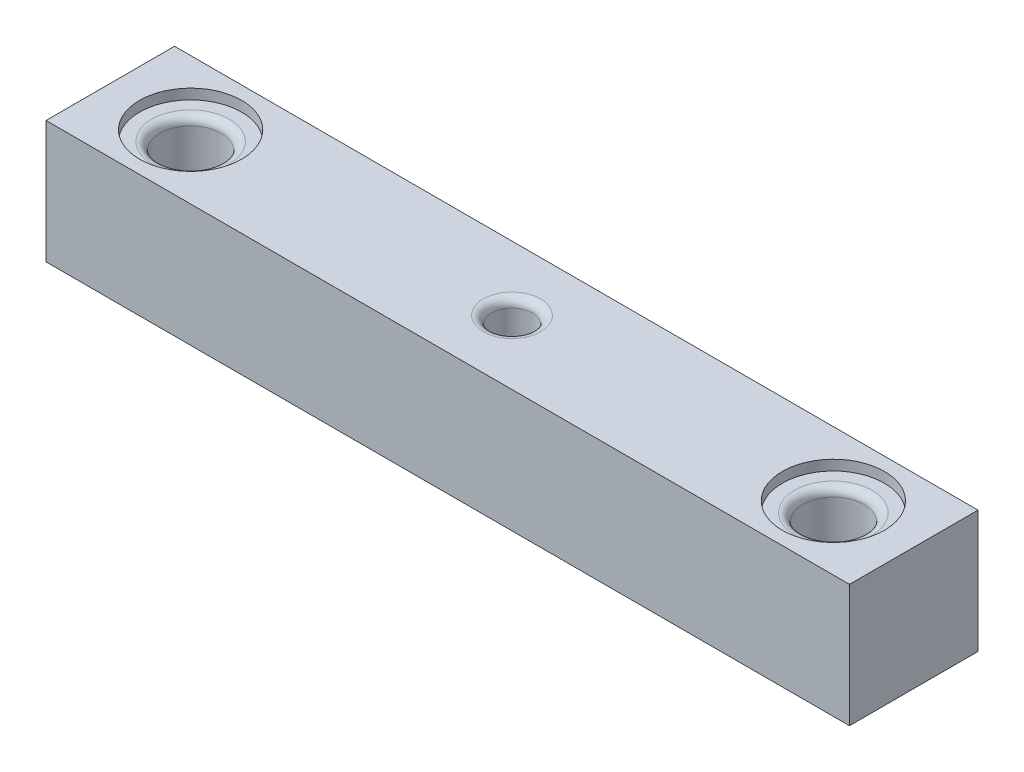
ISO-10303-21;
HEADER;
FILE_DESCRIPTION(('STEP AP214'),'2;1');
FILE_NAME('part.step','',(''),(''),'','','');
FILE_SCHEMA(('AUTOMOTIVE_DESIGN { 1 0 10303 214 1 1 1 1 }'));
ENDSEC;
DATA;
#1=APPLICATION_CONTEXT('core data for automotive mechanical design processes');
#2=APPLICATION_PROTOCOL_DEFINITION('international standard','automotive_design',2000,#1);
#3=PRODUCT_CONTEXT('',#1,'mechanical');
#4=PRODUCT('Part','Part','',(#3));
#5=PRODUCT_RELATED_PRODUCT_CATEGORY('part','',(#4));
#6=PRODUCT_DEFINITION_FORMATION('','',#4);
#7=PRODUCT_DEFINITION_CONTEXT('part definition',#1,'design');
#8=PRODUCT_DEFINITION('design','',#6,#7);
#9=PRODUCT_DEFINITION_SHAPE('','',#8);
#10=(LENGTH_UNIT() NAMED_UNIT(*) SI_UNIT(.MILLI.,.METRE.));
#11=(NAMED_UNIT(*) PLANE_ANGLE_UNIT() SI_UNIT($,.RADIAN.));
#12=(NAMED_UNIT(*) SI_UNIT($,.STERADIAN.) SOLID_ANGLE_UNIT());
#13=UNCERTAINTY_MEASURE_WITH_UNIT(LENGTH_MEASURE(1.E-05),#10,'distance_accuracy_value','');
#14=(GEOMETRIC_REPRESENTATION_CONTEXT(3) GLOBAL_UNCERTAINTY_ASSIGNED_CONTEXT((#13)) GLOBAL_UNIT_ASSIGNED_CONTEXT((#10,
#11,#12)) REPRESENTATION_CONTEXT('',''));
#15=CARTESIAN_POINT('',(0.,0.,0.));
#16=DIRECTION('',(0.,0.,1.));
#17=DIRECTION('',(1.,0.,0.));
#18=AXIS2_PLACEMENT_3D('',#15,#16,#17);
#19=CARTESIAN_POINT('',(-100.,38.1,-1.66533453693773E-13));
#20=DIRECTION('',(0.,-1.,0.));
#21=DIRECTION('',(0.,0.,-1.));
#22=AXIS2_PLACEMENT_3D('',#19,#20,#21);
#23=CYLINDRICAL_SURFACE('',#22,9.52500000000001);
#24=CARTESIAN_POINT('',(-100.,32.385,-1.66533453693773E-13));
#25=DIRECTION('',(0.,1.,0.));
#26=DIRECTION('',(0.,0.,1.));
#27=AXIS2_PLACEMENT_3D('',#24,#25,#26);
#28=CIRCLE('',#27,9.52500000000001);
#29=CARTESIAN_POINT('',(-100.,32.385,-9.52500000000017));
#30=VERTEX_POINT('',#29);
#31=EDGE_CURVE('E159',#30,#30,#28,.T.);
#32=CARTESIAN_POINT('',(-100.,0.,-1.66533453693773E-13));
#33=DIRECTION('',(0.,1.,0.));
#34=DIRECTION('',(0.,0.,1.));
#35=AXIS2_PLACEMENT_3D('',#32,#33,#34);
#36=CIRCLE('',#35,9.52500000000001);
#37=CARTESIAN_POINT('',(-100.,0.,-9.52500000000017));
#38=VERTEX_POINT('',#37);
#39=EDGE_CURVE('E126',#38,#38,#36,.T.);
#40=CARTESIAN_POINT('',(-100.,32.385,-9.52500000000017));
#41=CARTESIAN_POINT('',(-100.,32.04765625,-9.52500000000017));
#42=CARTESIAN_POINT('',(-100.,31.7103125,-9.52500000000017));
#43=CARTESIAN_POINT('',(-100.,31.035625,-9.52500000000017));
#44=CARTESIAN_POINT('',(-100.,30.69828125,-9.52500000000017));
#45=CARTESIAN_POINT('',(-100.,30.02359375,-9.52500000000017));
#46=CARTESIAN_POINT('',(-100.,29.68625,-9.52500000000017));
#47=CARTESIAN_POINT('',(-100.,29.0115625,-9.52500000000017));
#48=CARTESIAN_POINT('',(-100.,28.67421875,-9.52500000000017));
#49=CARTESIAN_POINT('',(-100.,27.99953125,-9.52500000000017));
#50=CARTESIAN_POINT('',(-100.,27.6621875,-9.52500000000017));
#51=CARTESIAN_POINT('',(-100.,26.9875,-9.52500000000017));
#52=CARTESIAN_POINT('',(-100.,26.65015625,-9.52500000000017));
#53=CARTESIAN_POINT('',(-100.,25.97546875,-9.52500000000017));
#54=CARTESIAN_POINT('',(-100.,25.638125,-9.52500000000017));
#55=CARTESIAN_POINT('',(-100.,24.9634375,-9.52500000000017));
#56=CARTESIAN_POINT('',(-100.,24.62609375,-9.52500000000017));
#57=CARTESIAN_POINT('',(-100.,23.95140625,-9.52500000000017));
#58=CARTESIAN_POINT('',(-100.,23.6140625,-9.52500000000017));
#59=CARTESIAN_POINT('',(-100.,22.939375,-9.52500000000017));
#60=CARTESIAN_POINT('',(-100.,22.60203125,-9.52500000000017));
#61=CARTESIAN_POINT('',(-100.,21.92734375,-9.52500000000017));
#62=CARTESIAN_POINT('',(-100.,21.59,-9.52500000000017));
#63=CARTESIAN_POINT('',(-100.,20.9153125,-9.52500000000017));
#64=CARTESIAN_POINT('',(-100.,20.57796875,-9.52500000000017));
#65=CARTESIAN_POINT('',(-100.,19.90328125,-9.52500000000017));
#66=CARTESIAN_POINT('',(-100.,19.5659375,-9.52500000000017));
#67=CARTESIAN_POINT('',(-100.,18.89125,-9.52500000000017));
#68=CARTESIAN_POINT('',(-100.,18.55390625,-9.52500000000017));
#69=CARTESIAN_POINT('',(-100.,17.87921875,-9.52500000000017));
#70=CARTESIAN_POINT('',(-100.,17.541875,-9.52500000000017));
#71=CARTESIAN_POINT('',(-100.,16.8671875,-9.52500000000017));
#72=CARTESIAN_POINT('',(-100.,16.52984375,-9.52500000000017));
#73=CARTESIAN_POINT('',(-100.,15.85515625,-9.52500000000017));
#74=CARTESIAN_POINT('',(-100.,15.5178125,-9.52500000000017));
#75=CARTESIAN_POINT('',(-100.,14.843125,-9.52500000000017));
#76=CARTESIAN_POINT('',(-100.,14.50578125,-9.52500000000017));
#77=CARTESIAN_POINT('',(-100.,13.83109375,-9.52500000000017));
#78=CARTESIAN_POINT('',(-100.,13.49375,-9.52500000000017));
#79=CARTESIAN_POINT('',(-100.,12.8190625,-9.52500000000017));
#80=CARTESIAN_POINT('',(-100.,12.48171875,-9.52500000000017));
#81=CARTESIAN_POINT('',(-100.,11.80703125,-9.52500000000017));
#82=CARTESIAN_POINT('',(-100.,11.4696875,-9.52500000000017));
#83=CARTESIAN_POINT('',(-100.,10.795,-9.52500000000017));
#84=CARTESIAN_POINT('',(-100.,10.45765625,-9.52500000000017));
#85=CARTESIAN_POINT('',(-100.,9.78296874999999,-9.52500000000017));
#86=CARTESIAN_POINT('',(-100.,9.445625,-9.52500000000017));
#87=CARTESIAN_POINT('',(-100.,8.7709375,-9.52500000000017));
#88=CARTESIAN_POINT('',(-100.,8.43359375,-9.52500000000017));
#89=CARTESIAN_POINT('',(-100.,7.75890625,-9.52500000000017));
#90=CARTESIAN_POINT('',(-100.,7.4215625,-9.52500000000017));
#91=CARTESIAN_POINT('',(-100.,6.746875,-9.52500000000017));
#92=CARTESIAN_POINT('',(-100.,6.40953125,-9.52500000000017));
#93=CARTESIAN_POINT('',(-100.,5.73484375,-9.52500000000017));
#94=CARTESIAN_POINT('',(-100.,5.3975,-9.52500000000017));
#95=CARTESIAN_POINT('',(-100.,4.7228125,-9.52500000000017));
#96=CARTESIAN_POINT('',(-100.,4.38546875,-9.52500000000017));
#97=CARTESIAN_POINT('',(-100.,3.71078125,-9.52500000000017));
#98=CARTESIAN_POINT('',(-100.,3.3734375,-9.52500000000017));
#99=CARTESIAN_POINT('',(-100.,2.69875,-9.52500000000017));
#100=CARTESIAN_POINT('',(-100.,2.36140624999999,-9.52500000000017));
#101=CARTESIAN_POINT('',(-100.,1.68671875,-9.52500000000017));
#102=CARTESIAN_POINT('',(-100.,1.349375,-9.52500000000017));
#103=CARTESIAN_POINT('',(-100.,0.674687500000002,-9.52500000000017));
#104=CARTESIAN_POINT('',(-100.,0.337343750000001,-9.52500000000017));
#105=CARTESIAN_POINT('',(-100.,0.,-9.52500000000017));
#106=B_SPLINE_CURVE_WITH_KNOTS('',3,(#40,#41,#42,#43,#44,#45,#46,#47,#48,#49,#50,#51,#52,#53,
#54,#55,#56,#57,#58,#59,#60,#61,#62,#63,#64,#65,#66,#67,#68,#69,#70,#71,#72,#73,#74,#75,#76,#77,
#78,#79,#80,#81,#82,#83,#84,#85,#86,#87,#88,#89,#90,#91,#92,#93,#94,#95,#96,#97,#98,#99,#100,
#101,#102,#103,#104,#105),.UNSPECIFIED.,.F.,.F.,(4,2,2,2,2,2,2,2,2,2,2,2,2,2,2,2,2,2,2,2,2,2,2,
2,2,2,2,2,2,2,2,2,4),(0.,1.01203125,2.0240625,3.03609375,4.048125,5.06015625,6.07218750000001,
7.08421875,8.09625000000001,9.10828125,10.1203125,11.13234375,12.144375,13.15640625,14.1684375,
15.18046875,16.1925,17.20453125,18.2165625,19.22859375,20.240625,21.25265625,22.2646875,
23.27671875,24.28875,25.30078125,26.3128125,27.32484375,28.336875,29.34890625,30.3609375,
31.37296875,32.385),.UNSPECIFIED.);
#107=EDGE_CURVE('BSEAM51',#30,#38,#106,.T.);
#108=ORIENTED_EDGE('',*,*,#31,.T.);
#109=ORIENTED_EDGE('',*,*,#39,.F.);
#110=ORIENTED_EDGE('',*,*,#107,.T.);
#111=ORIENTED_EDGE('',*,*,#107,.F.);
#112=EDGE_LOOP('',(#108,#110,#109,#111));
#113=FACE_BOUND('',#112,.T.);
#114=ADVANCED_FACE('F51',(#113),#23,.F.);
#115=CARTESIAN_POINT('',(100.,38.1,-1.66533453693773E-13));
#116=DIRECTION('',(0.,-1.,0.));
#117=DIRECTION('',(0.,0.,-1.));
#118=AXIS2_PLACEMENT_3D('',#115,#116,#117);
#119=CYLINDRICAL_SURFACE('',#118,9.52500000000001);
#120=CARTESIAN_POINT('',(100.,32.385,-1.66533453693773E-13));
#121=DIRECTION('',(0.,1.,0.));
#122=DIRECTION('',(0.,0.,1.));
#123=AXIS2_PLACEMENT_3D('',#120,#121,#122);
#124=CIRCLE('',#123,9.52500000000001);
#125=CARTESIAN_POINT('',(100.,32.385,-9.52500000000017));
#126=VERTEX_POINT('',#125);
#127=EDGE_CURVE('E148',#126,#126,#124,.T.);
#128=CARTESIAN_POINT('',(100.,0.,-1.66533453693773E-13));
#129=DIRECTION('',(0.,1.,0.));
#130=DIRECTION('',(0.,0.,1.));
#131=AXIS2_PLACEMENT_3D('',#128,#129,#130);
#132=CIRCLE('',#131,9.52500000000001);
#133=CARTESIAN_POINT('',(100.,0.,-9.52500000000017));
#134=VERTEX_POINT('',#133);
#135=EDGE_CURVE('E124',#134,#134,#132,.T.);
#136=CARTESIAN_POINT('',(100.,32.385,-9.52500000000017));
#137=CARTESIAN_POINT('',(100.,32.04765625,-9.52500000000017));
#138=CARTESIAN_POINT('',(100.,31.7103125,-9.52500000000017));
#139=CARTESIAN_POINT('',(100.,31.035625,-9.52500000000017));
#140=CARTESIAN_POINT('',(100.,30.69828125,-9.52500000000017));
#141=CARTESIAN_POINT('',(100.,30.02359375,-9.52500000000017));
#142=CARTESIAN_POINT('',(100.,29.68625,-9.52500000000017));
#143=CARTESIAN_POINT('',(100.,29.0115625,-9.52500000000017));
#144=CARTESIAN_POINT('',(100.,28.67421875,-9.52500000000017));
#145=CARTESIAN_POINT('',(100.,27.99953125,-9.52500000000017));
#146=CARTESIAN_POINT('',(100.,27.6621875,-9.52500000000017));
#147=CARTESIAN_POINT('',(100.,26.9875,-9.52500000000017));
#148=CARTESIAN_POINT('',(100.,26.65015625,-9.52500000000017));
#149=CARTESIAN_POINT('',(100.,25.97546875,-9.52500000000017));
#150=CARTESIAN_POINT('',(100.,25.638125,-9.52500000000017));
#151=CARTESIAN_POINT('',(100.,24.9634375,-9.52500000000017));
#152=CARTESIAN_POINT('',(100.,24.62609375,-9.52500000000017));
#153=CARTESIAN_POINT('',(100.,23.95140625,-9.52500000000017));
#154=CARTESIAN_POINT('',(100.,23.6140625,-9.52500000000017));
#155=CARTESIAN_POINT('',(100.,22.939375,-9.52500000000017));
#156=CARTESIAN_POINT('',(100.,22.60203125,-9.52500000000017));
#157=CARTESIAN_POINT('',(100.,21.92734375,-9.52500000000017));
#158=CARTESIAN_POINT('',(100.,21.59,-9.52500000000017));
#159=CARTESIAN_POINT('',(100.,20.9153125,-9.52500000000017));
#160=CARTESIAN_POINT('',(100.,20.57796875,-9.52500000000017));
#161=CARTESIAN_POINT('',(100.,19.90328125,-9.52500000000017));
#162=CARTESIAN_POINT('',(100.,19.5659375,-9.52500000000017));
#163=CARTESIAN_POINT('',(100.,18.89125,-9.52500000000017));
#164=CARTESIAN_POINT('',(100.,18.55390625,-9.52500000000017));
#165=CARTESIAN_POINT('',(100.,17.87921875,-9.52500000000017));
#166=CARTESIAN_POINT('',(100.,17.541875,-9.52500000000017));
#167=CARTESIAN_POINT('',(100.,16.8671875,-9.52500000000017));
#168=CARTESIAN_POINT('',(100.,16.52984375,-9.52500000000017));
#169=CARTESIAN_POINT('',(100.,15.85515625,-9.52500000000017));
#170=CARTESIAN_POINT('',(100.,15.5178125,-9.52500000000017));
#171=CARTESIAN_POINT('',(100.,14.843125,-9.52500000000017));
#172=CARTESIAN_POINT('',(100.,14.50578125,-9.52500000000017));
#173=CARTESIAN_POINT('',(100.,13.83109375,-9.52500000000017));
#174=CARTESIAN_POINT('',(100.,13.49375,-9.52500000000017));
#175=CARTESIAN_POINT('',(100.,12.8190625,-9.52500000000017));
#176=CARTESIAN_POINT('',(100.,12.48171875,-9.52500000000017));
#177=CARTESIAN_POINT('',(100.,11.80703125,-9.52500000000017));
#178=CARTESIAN_POINT('',(100.,11.4696875,-9.52500000000017));
#179=CARTESIAN_POINT('',(100.,10.795,-9.52500000000017));
#180=CARTESIAN_POINT('',(100.,10.45765625,-9.52500000000017));
#181=CARTESIAN_POINT('',(100.,9.78296874999999,-9.52500000000017));
#182=CARTESIAN_POINT('',(100.,9.445625,-9.52500000000017));
#183=CARTESIAN_POINT('',(100.,8.7709375,-9.52500000000017));
#184=CARTESIAN_POINT('',(100.,8.43359375,-9.52500000000017));
#185=CARTESIAN_POINT('',(100.,7.75890625,-9.52500000000017));
#186=CARTESIAN_POINT('',(100.,7.4215625,-9.52500000000017));
#187=CARTESIAN_POINT('',(100.,6.746875,-9.52500000000017));
#188=CARTESIAN_POINT('',(100.,6.40953125,-9.52500000000017));
#189=CARTESIAN_POINT('',(100.,5.73484375,-9.52500000000017));
#190=CARTESIAN_POINT('',(100.,5.3975,-9.52500000000017));
#191=CARTESIAN_POINT('',(100.,4.7228125,-9.52500000000017));
#192=CARTESIAN_POINT('',(100.,4.38546875,-9.52500000000017));
#193=CARTESIAN_POINT('',(100.,3.71078125,-9.52500000000017));
#194=CARTESIAN_POINT('',(100.,3.3734375,-9.52500000000017));
#195=CARTESIAN_POINT('',(100.,2.69875,-9.52500000000017));
#196=CARTESIAN_POINT('',(100.,2.36140624999999,-9.52500000000017));
#197=CARTESIAN_POINT('',(100.,1.68671875,-9.52500000000017));
#198=CARTESIAN_POINT('',(100.,1.349375,-9.52500000000017));
#199=CARTESIAN_POINT('',(100.,0.674687500000002,-9.52500000000017));
#200=CARTESIAN_POINT('',(100.,0.337343750000001,-9.52500000000017));
#201=CARTESIAN_POINT('',(100.,0.,-9.52500000000017));
#202=B_SPLINE_CURVE_WITH_KNOTS('',3,(#136,#137,#138,#139,#140,#141,#142,#143,#144,#145,#146,
#147,#148,#149,#150,#151,#152,#153,#154,#155,#156,#157,#158,#159,#160,#161,#162,#163,#164,#165,
#166,#167,#168,#169,#170,#171,#172,#173,#174,#175,#176,#177,#178,#179,#180,#181,#182,#183,#184,
#185,#186,#187,#188,#189,#190,#191,#192,#193,#194,#195,#196,#197,#198,#199,#200,#201),
.UNSPECIFIED.,.F.,.F.,(4,2,2,2,2,2,2,2,2,2,2,2,2,2,2,2,2,2,2,2,2,2,2,2,2,2,2,2,2,2,2,2,4),(0.,
1.01203125,2.0240625,3.03609375,4.048125,5.06015625,6.07218750000001,7.08421875,
8.09625000000001,9.10828125,10.1203125,11.13234375,12.144375,13.15640625,14.1684375,15.18046875,
16.1925,17.20453125,18.2165625,19.22859375,20.240625,21.25265625,22.2646875,23.27671875,
24.28875,25.30078125,26.3128125,27.32484375,28.336875,29.34890625,30.3609375,31.37296875,
32.385),.UNSPECIFIED.);
#203=EDGE_CURVE('BSEAM181',#126,#134,#202,.T.);
#204=ORIENTED_EDGE('',*,*,#127,.T.);
#205=ORIENTED_EDGE('',*,*,#135,.F.);
#206=ORIENTED_EDGE('',*,*,#203,.T.);
#207=ORIENTED_EDGE('',*,*,#203,.F.);
#208=EDGE_LOOP('',(#204,#206,#205,#207));
#209=FACE_BOUND('',#208,.T.);
#210=ADVANCED_FACE('F181',(#209),#119,.F.);
#211=CARTESIAN_POINT('',(0.,38.1,19.9999999999999));
#212=DIRECTION('',(0.,0.,-1.));
#213=DIRECTION('',(-1.,0.,0.));
#214=AXIS2_PLACEMENT_3D('',#211,#212,#213);
#215=PLANE('',#214);
#216=DIRECTION('',(1.,0.,0.));
#217=VECTOR('',#216,1.);
#218=CARTESIAN_POINT('',(0.,0.,19.9999999999999));
#219=LINE('',#218,#217);
#220=CARTESIAN_POINT('',(-124.999999999999,0.,19.9999999999999));
#221=VERTEX_POINT('',#220);
#222=CARTESIAN_POINT('',(125.000000000001,0.,19.9999999999999));
#223=VERTEX_POINT('',#222);
#224=EDGE_CURVE('E134',#221,#223,#219,.T.);
#225=ORIENTED_EDGE('',*,*,#224,.T.);
#226=DIRECTION('',(0.,-1.,0.));
#227=VECTOR('',#226,1.);
#228=CARTESIAN_POINT('',(125.000000000001,38.1,19.9999999999999));
#229=LINE('',#228,#227);
#230=CARTESIAN_POINT('',(125.000000000001,38.1,19.9999999999999));
#231=VERTEX_POINT('',#230);
#232=EDGE_CURVE('E107',#231,#223,#229,.T.);
#233=ORIENTED_EDGE('',*,*,#232,.F.);
#234=DIRECTION('',(1.,0.,0.));
#235=VECTOR('',#234,1.);
#236=CARTESIAN_POINT('',(0.,38.1,19.9999999999999));
#237=LINE('',#236,#235);
#238=CARTESIAN_POINT('',(-124.999999999999,38.1,19.9999999999999));
#239=VERTEX_POINT('',#238);
#240=EDGE_CURVE('E95',#239,#231,#237,.T.);
#241=ORIENTED_EDGE('',*,*,#240,.F.);
#242=DIRECTION('',(0.,-1.,0.));
#243=VECTOR('',#242,1.);
#244=CARTESIAN_POINT('',(-124.999999999999,38.1,19.9999999999999));
#245=LINE('',#244,#243);
#246=EDGE_CURVE('E118',#239,#221,#245,.T.);
#247=ORIENTED_EDGE('',*,*,#246,.T.);
#248=EDGE_LOOP('',(#225,#233,#241,#247));
#249=FACE_BOUND('',#248,.T.);
#250=ADVANCED_FACE('F189',(#249),#215,.F.);
#251=CARTESIAN_POINT('',(125.000000000001,38.1,0.));
#252=DIRECTION('',(1.,0.,0.));
#253=DIRECTION('',(0.,0.,-1.));
#254=AXIS2_PLACEMENT_3D('',#251,#252,#253);
#255=PLANE('',#254);
#256=DIRECTION('',(0.,0.,1.));
#257=VECTOR('',#256,1.);
#258=CARTESIAN_POINT('',(125.000000000001,0.,0.));
#259=LINE('',#258,#257);
#260=CARTESIAN_POINT('',(125.000000000001,0.,-20.0000000000001));
#261=VERTEX_POINT('',#260);
#262=EDGE_CURVE('E101',#261,#223,#259,.T.);
#263=ORIENTED_EDGE('',*,*,#262,.F.);
#264=DIRECTION('',(0.,-1.,0.));
#265=VECTOR('',#264,1.);
#266=CARTESIAN_POINT('',(125.000000000001,38.1,-20.0000000000001));
#267=LINE('',#266,#265);
#268=CARTESIAN_POINT('',(125.000000000001,38.1,-20.0000000000001));
#269=VERTEX_POINT('',#268);
#270=EDGE_CURVE('E100',#269,#261,#267,.T.);
#271=ORIENTED_EDGE('',*,*,#270,.F.);
#272=DIRECTION('',(0.,0.,1.));
#273=VECTOR('',#272,1.);
#274=CARTESIAN_POINT('',(125.000000000001,38.1,0.));
#275=LINE('',#274,#273);
#276=EDGE_CURVE('E103',#269,#231,#275,.T.);
#277=ORIENTED_EDGE('',*,*,#276,.T.);
#278=ORIENTED_EDGE('',*,*,#232,.T.);
#279=EDGE_LOOP('',(#263,#271,#277,#278));
#280=FACE_BOUND('',#279,.T.);
#281=ADVANCED_FACE('F99',(#280),#255,.T.);
#282=CARTESIAN_POINT('',(0.,38.1,-20.0000000000001));
#283=DIRECTION('',(0.,0.,-1.));
#284=DIRECTION('',(-1.,0.,0.));
#285=AXIS2_PLACEMENT_3D('',#282,#283,#284);
#286=PLANE('',#285);
#287=DIRECTION('',(1.,0.,0.));
#288=VECTOR('',#287,1.);
#289=CARTESIAN_POINT('',(0.,0.,-20.0000000000001));
#290=LINE('',#289,#288);
#291=CARTESIAN_POINT('',(-124.999999999999,0.,-20.0000000000001));
#292=VERTEX_POINT('',#291);
#293=EDGE_CURVE('E140',#292,#261,#290,.T.);
#294=ORIENTED_EDGE('',*,*,#293,.F.);
#295=DIRECTION('',(0.,-1.,0.));
#296=VECTOR('',#295,1.);
#297=CARTESIAN_POINT('',(-124.999999999999,38.1,-20.0000000000001));
#298=LINE('',#297,#296);
#299=CARTESIAN_POINT('',(-124.999999999999,38.1,-20.0000000000001));
#300=VERTEX_POINT('',#299);
#301=EDGE_CURVE('E82',#300,#292,#298,.T.);
#302=ORIENTED_EDGE('',*,*,#301,.F.);
#303=DIRECTION('',(1.,0.,0.));
#304=VECTOR('',#303,1.);
#305=CARTESIAN_POINT('',(0.,38.1,-20.0000000000001));
#306=LINE('',#305,#304);
#307=EDGE_CURVE('E115',#300,#269,#306,.T.);
#308=ORIENTED_EDGE('',*,*,#307,.T.);
#309=ORIENTED_EDGE('',*,*,#270,.T.);
#310=EDGE_LOOP('',(#294,#302,#308,#309));
#311=FACE_BOUND('',#310,.T.);
#312=ADVANCED_FACE('F114',(#311),#286,.T.);
#313=CARTESIAN_POINT('',(-124.999999999999,38.1,0.));
#314=DIRECTION('',(1.,0.,0.));
#315=DIRECTION('',(0.,0.,-1.));
#316=AXIS2_PLACEMENT_3D('',#313,#314,#315);
#317=PLANE('',#316);
#318=DIRECTION('',(0.,0.,1.));
#319=VECTOR('',#318,1.);
#320=CARTESIAN_POINT('',(-124.999999999999,0.,0.));
#321=LINE('',#320,#319);
#322=EDGE_CURVE('E90',#292,#221,#321,.T.);
#323=ORIENTED_EDGE('',*,*,#322,.T.);
#324=ORIENTED_EDGE('',*,*,#246,.F.);
#325=DIRECTION('',(0.,0.,1.));
#326=VECTOR('',#325,1.);
#327=CARTESIAN_POINT('',(-124.999999999999,38.1,0.));
#328=LINE('',#327,#326);
#329=EDGE_CURVE('E66',#300,#239,#328,.T.);
#330=ORIENTED_EDGE('',*,*,#329,.F.);
#331=ORIENTED_EDGE('',*,*,#301,.T.);
#332=EDGE_LOOP('',(#323,#324,#330,#331));
#333=FACE_BOUND('',#332,.T.);
#334=ADVANCED_FACE('F219',(#333),#317,.F.);
#335=CARTESIAN_POINT('',(0.,38.1,0.));
#336=DIRECTION('',(0.,1.,0.));
#337=DIRECTION('',(0.,0.,1.));
#338=AXIS2_PLACEMENT_3D('',#335,#336,#337);
#339=PLANE('',#338);
#340=CARTESIAN_POINT('',(0.,38.1,0.));
#341=DIRECTION('',(0.,1.,0.));
#342=DIRECTION('',(0.,0.,1.));
#343=AXIS2_PLACEMENT_3D('',#340,#341,#342);
#344=CIRCLE('',#343,8.89);
#345=CARTESIAN_POINT('',(0.,38.1,8.89));
#346=VERTEX_POINT('',#345);
#347=EDGE_CURVE('E12',#346,#346,#344,.F.);
#348=ORIENTED_EDGE('',*,*,#347,.T.);
#349=EDGE_LOOP('',(#348));
#350=FACE_BOUND('',#349,.T.);
#351=CARTESIAN_POINT('',(-100.,38.1,-1.66533453693773E-13));
#352=DIRECTION('',(0.,1.,0.));
#353=DIRECTION('',(0.,0.,1.));
#354=AXIS2_PLACEMENT_3D('',#351,#352,#353);
#355=CIRCLE('',#354,15.8749999999999);
#356=CARTESIAN_POINT('',(-100.,38.1,15.8749999999998));
#357=VERTEX_POINT('',#356);
#358=EDGE_CURVE('E420',#357,#357,#355,.T.);
#359=ORIENTED_EDGE('',*,*,#358,.F.);
#360=EDGE_LOOP('',(#359));
#361=FACE_BOUND('',#360,.T.);
#362=CARTESIAN_POINT('',(100.,38.1,-1.66533453693773E-13));
#363=DIRECTION('',(0.,1.,0.));
#364=DIRECTION('',(0.,0.,1.));
#365=AXIS2_PLACEMENT_3D('',#362,#363,#364);
#366=CIRCLE('',#365,15.8749999999999);
#367=CARTESIAN_POINT('',(100.,38.1,15.8749999999998));
#368=VERTEX_POINT('',#367);
#369=EDGE_CURVE('E422',#368,#368,#366,.T.);
#370=ORIENTED_EDGE('',*,*,#369,.F.);
#371=EDGE_LOOP('',(#370));
#372=FACE_BOUND('',#371,.T.);
#373=ORIENTED_EDGE('',*,*,#240,.T.);
#374=ORIENTED_EDGE('',*,*,#276,.F.);
#375=ORIENTED_EDGE('',*,*,#307,.F.);
#376=ORIENTED_EDGE('',*,*,#329,.T.);
#377=EDGE_LOOP('',(#373,#374,#375,#376));
#378=FACE_BOUND('',#377,.T.);
#379=ADVANCED_FACE('F111',(#350,#361,#372,#378),#339,.T.);
#380=CARTESIAN_POINT('',(0.,0.,0.));
#381=DIRECTION('',(0.,1.,0.));
#382=DIRECTION('',(0.,0.,1.));
#383=AXIS2_PLACEMENT_3D('',#380,#381,#382);
#384=PLANE('',#383);
#385=CARTESIAN_POINT('',(0.,0.,0.));
#386=DIRECTION('',(0.,1.,0.));
#387=DIRECTION('',(0.,0.,1.));
#388=AXIS2_PLACEMENT_3D('',#385,#386,#387);
#389=CIRCLE('',#388,6.35);
#390=CARTESIAN_POINT('',(0.,0.,6.35));
#391=VERTEX_POINT('',#390);
#392=EDGE_CURVE('E424',#391,#391,#389,.T.);
#393=ORIENTED_EDGE('',*,*,#392,.T.);
#394=EDGE_LOOP('',(#393));
#395=FACE_BOUND('',#394,.T.);
#396=ORIENTED_EDGE('',*,*,#135,.T.);
#397=EDGE_LOOP('',(#396));
#398=FACE_BOUND('',#397,.T.);
#399=ORIENTED_EDGE('',*,*,#39,.T.);
#400=EDGE_LOOP('',(#399));
#401=FACE_BOUND('',#400,.T.);
#402=ORIENTED_EDGE('',*,*,#224,.F.);
#403=ORIENTED_EDGE('',*,*,#322,.F.);
#404=ORIENTED_EDGE('',*,*,#293,.T.);
#405=ORIENTED_EDGE('',*,*,#262,.T.);
#406=EDGE_LOOP('',(#402,#403,#404,#405));
#407=FACE_BOUND('',#406,.T.);
#408=ADVANCED_FACE('F206',(#395,#398,#401,#407),#384,.F.);
#409=CARTESIAN_POINT('',(100.,34.925,-1.66533453693773E-13));
#410=DIRECTION('',(0.,1.,0.));
#411=DIRECTION('',(0.,0.,1.));
#412=AXIS2_PLACEMENT_3D('',#409,#410,#411);
#413=CYLINDRICAL_SURFACE('',#412,15.8749999999999);
#414=CARTESIAN_POINT('',(100.,34.925,-1.66533453693773E-13));
#415=DIRECTION('',(0.,1.,0.));
#416=DIRECTION('',(0.,0.,1.));
#417=AXIS2_PLACEMENT_3D('',#414,#415,#416);
#418=CIRCLE('',#417,15.8749999999999);
#419=CARTESIAN_POINT('',(100.,34.925,15.8749999999998));
#420=VERTEX_POINT('',#419);
#421=EDGE_CURVE('E427',#420,#420,#418,.T.);
#422=ORIENTED_EDGE('',*,*,#421,.F.);
#423=EDGE_LOOP('',(#422));
#424=FACE_BOUND('',#423,.T.);
#425=ORIENTED_EDGE('',*,*,#369,.T.);
#426=EDGE_LOOP('',(#425));
#427=FACE_BOUND('',#426,.T.);
#428=ADVANCED_FACE('F208',(#424,#427),#413,.F.);
#429=CARTESIAN_POINT('',(100.,34.925,-1.66533453693773E-13));
#430=DIRECTION('',(0.,1.,0.));
#431=DIRECTION('',(0.,0.,1.));
#432=AXIS2_PLACEMENT_3D('',#429,#430,#431);
#433=PLANE('',#432);
#434=CARTESIAN_POINT('',(100.,34.925,-1.66533453693773E-13));
#435=DIRECTION('',(0.,1.,0.));
#436=DIRECTION('',(0.,0.,1.));
#437=AXIS2_PLACEMENT_3D('',#434,#435,#436);
#438=CIRCLE('',#437,12.065);
#439=CARTESIAN_POINT('',(100.,34.925,12.0649999999998));
#440=VERTEX_POINT('',#439);
#441=EDGE_CURVE('E155',#440,#440,#438,.F.);
#442=ORIENTED_EDGE('',*,*,#441,.T.);
#443=EDGE_LOOP('',(#442));
#444=FACE_BOUND('',#443,.T.);
#445=ORIENTED_EDGE('',*,*,#421,.T.);
#446=EDGE_LOOP('',(#445));
#447=FACE_BOUND('',#446,.T.);
#448=ADVANCED_FACE('F361',(#444,#447),#433,.T.);
#449=CARTESIAN_POINT('',(-100.,34.925,-1.66533453693773E-13));
#450=DIRECTION('',(0.,1.,0.));
#451=DIRECTION('',(0.,0.,1.));
#452=AXIS2_PLACEMENT_3D('',#449,#450,#451);
#453=CYLINDRICAL_SURFACE('',#452,15.8749999999999);
#454=CARTESIAN_POINT('',(-100.,34.925,-1.66533453693773E-13));
#455=DIRECTION('',(0.,1.,0.));
#456=DIRECTION('',(0.,0.,1.));
#457=AXIS2_PLACEMENT_3D('',#454,#455,#456);
#458=CIRCLE('',#457,15.8749999999999);
#459=CARTESIAN_POINT('',(-100.,34.925,15.8749999999998));
#460=VERTEX_POINT('',#459);
#461=EDGE_CURVE('E130',#460,#460,#458,.T.);
#462=ORIENTED_EDGE('',*,*,#461,.F.);
#463=EDGE_LOOP('',(#462));
#464=FACE_BOUND('',#463,.T.);
#465=ORIENTED_EDGE('',*,*,#358,.T.);
#466=EDGE_LOOP('',(#465));
#467=FACE_BOUND('',#466,.T.);
#468=ADVANCED_FACE('F375',(#464,#467),#453,.F.);
#469=CARTESIAN_POINT('',(-100.,34.925,-1.66533453693773E-13));
#470=DIRECTION('',(0.,1.,0.));
#471=DIRECTION('',(0.,0.,1.));
#472=AXIS2_PLACEMENT_3D('',#469,#470,#471);
#473=PLANE('',#472);
#474=CARTESIAN_POINT('',(-100.,34.925,-1.66533453693773E-13));
#475=DIRECTION('',(0.,1.,0.));
#476=DIRECTION('',(0.,0.,1.));
#477=AXIS2_PLACEMENT_3D('',#474,#475,#476);
#478=CIRCLE('',#477,12.065);
#479=CARTESIAN_POINT('',(-100.,34.925,12.0649999999998));
#480=VERTEX_POINT('',#479);
#481=EDGE_CURVE('E163',#480,#480,#478,.F.);
#482=ORIENTED_EDGE('',*,*,#481,.T.);
#483=EDGE_LOOP('',(#482));
#484=FACE_BOUND('',#483,.T.);
#485=ORIENTED_EDGE('',*,*,#461,.T.);
#486=EDGE_LOOP('',(#485));
#487=FACE_BOUND('',#486,.T.);
#488=ADVANCED_FACE('F198',(#484,#487),#473,.T.);
#489=CARTESIAN_POINT('',(0.,0.,0.));
#490=DIRECTION('',(0.,1.,0.));
#491=DIRECTION('',(0.,0.,1.));
#492=AXIS2_PLACEMENT_3D('',#489,#490,#491);
#493=CYLINDRICAL_SURFACE('',#492,6.35);
#494=CARTESIAN_POINT('',(0.,35.56,0.));
#495=DIRECTION('',(0.,1.,0.));
#496=DIRECTION('',(0.,0.,1.));
#497=AXIS2_PLACEMENT_3D('',#494,#495,#496);
#498=CIRCLE('',#497,6.35);
#499=CARTESIAN_POINT('',(0.,35.56,6.35));
#500=VERTEX_POINT('',#499);
#501=EDGE_CURVE('E64',#500,#500,#498,.T.);
#502=CARTESIAN_POINT('',(0.,35.56,6.35));
#503=CARTESIAN_POINT('',(0.,35.1895833333333,6.35));
#504=CARTESIAN_POINT('',(0.,34.8191666666667,6.35));
#505=CARTESIAN_POINT('',(0.,34.0783333333333,6.35));
#506=CARTESIAN_POINT('',(0.,33.7079166666666,6.35));
#507=CARTESIAN_POINT('',(0.,32.9670833333333,6.35));
#508=CARTESIAN_POINT('',(0.,32.5966666666667,6.35));
#509=CARTESIAN_POINT('',(0.,31.8558333333333,6.35));
#510=CARTESIAN_POINT('',(0.,31.4854166666667,6.35));
#511=CARTESIAN_POINT('',(0.,30.7445833333333,6.35));
#512=CARTESIAN_POINT('',(0.,30.3741666666667,6.35));
#513=CARTESIAN_POINT('',(0.,29.6333333333333,6.35));
#514=CARTESIAN_POINT('',(0.,29.2629166666667,6.35));
#515=CARTESIAN_POINT('',(0.,28.5220833333333,6.35));
#516=CARTESIAN_POINT('',(0.,28.1516666666667,6.35));
#517=CARTESIAN_POINT('',(0.,27.4108333333333,6.35));
#518=CARTESIAN_POINT('',(0.,27.0404166666667,6.35));
#519=CARTESIAN_POINT('',(0.,26.2995833333333,6.35));
#520=CARTESIAN_POINT('',(0.,25.9291666666667,6.35));
#521=CARTESIAN_POINT('',(0.,25.1883333333333,6.35));
#522=CARTESIAN_POINT('',(0.,24.8179166666667,6.35));
#523=CARTESIAN_POINT('',(0.,24.0770833333333,6.35));
#524=CARTESIAN_POINT('',(0.,23.7066666666667,6.35));
#525=CARTESIAN_POINT('',(0.,22.9658333333333,6.35));
#526=CARTESIAN_POINT('',(0.,22.5954166666667,6.35));
#527=CARTESIAN_POINT('',(0.,21.8545833333333,6.35));
#528=CARTESIAN_POINT('',(0.,21.4841666666667,6.35));
#529=CARTESIAN_POINT('',(0.,20.7433333333333,6.35));
#530=CARTESIAN_POINT('',(0.,20.3729166666667,6.35));
#531=CARTESIAN_POINT('',(0.,19.6320833333333,6.35));
#532=CARTESIAN_POINT('',(0.,19.2616666666667,6.35));
#533=CARTESIAN_POINT('',(0.,18.5208333333333,6.35));
#534=CARTESIAN_POINT('',(0.,18.1504166666667,6.35));
#535=CARTESIAN_POINT('',(0.,17.4095833333333,6.35));
#536=CARTESIAN_POINT('',(0.,17.0391666666667,6.35));
#537=CARTESIAN_POINT('',(0.,16.2983333333333,6.35));
#538=CARTESIAN_POINT('',(0.,15.9279166666667,6.35));
#539=CARTESIAN_POINT('',(0.,15.1870833333333,6.35));
#540=CARTESIAN_POINT('',(0.,14.8166666666667,6.35));
#541=CARTESIAN_POINT('',(0.,14.0758333333333,6.35));
#542=CARTESIAN_POINT('',(0.,13.7054166666667,6.35));
#543=CARTESIAN_POINT('',(0.,12.9645833333333,6.35));
#544=CARTESIAN_POINT('',(0.,12.5941666666667,6.35));
#545=CARTESIAN_POINT('',(0.,11.8533333333333,6.35));
#546=CARTESIAN_POINT('',(0.,11.4829166666667,6.35));
#547=CARTESIAN_POINT('',(0.,10.7420833333333,6.35));
#548=CARTESIAN_POINT('',(0.,10.3716666666667,6.35));
#549=CARTESIAN_POINT('',(0.,9.63083333333333,6.35));
#550=CARTESIAN_POINT('',(0.,9.26041666666666,6.35));
#551=CARTESIAN_POINT('',(0.,8.51958333333333,6.35));
#552=CARTESIAN_POINT('',(0.,8.14916666666666,6.35));
#553=CARTESIAN_POINT('',(0.,7.40833333333333,6.35));
#554=CARTESIAN_POINT('',(0.,7.03791666666666,6.35));
#555=CARTESIAN_POINT('',(0.,6.29708333333333,6.35));
#556=CARTESIAN_POINT('',(0.,5.92666666666666,6.35));
#557=CARTESIAN_POINT('',(0.,5.18583333333333,6.35));
#558=CARTESIAN_POINT('',(0.,4.81541666666666,6.35));
#559=CARTESIAN_POINT('',(0.,4.07458333333333,6.35));
#560=CARTESIAN_POINT('',(0.,3.70416666666666,6.35));
#561=CARTESIAN_POINT('',(0.,2.96333333333333,6.35));
#562=CARTESIAN_POINT('',(0.,2.59291666666667,6.35));
#563=CARTESIAN_POINT('',(0.,1.85208333333333,6.35));
#564=CARTESIAN_POINT('',(0.,1.48166666666667,6.35));
#565=CARTESIAN_POINT('',(0.,0.740833333333334,6.35));
#566=CARTESIAN_POINT('',(0.,0.370416666666667,6.35));
#567=CARTESIAN_POINT('',(0.,0.,6.35));
#568=B_SPLINE_CURVE_WITH_KNOTS('',3,(#502,#503,#504,#505,#506,#507,#508,#509,#510,#511,#512,
#513,#514,#515,#516,#517,#518,#519,#520,#521,#522,#523,#524,#525,#526,#527,#528,#529,#530,#531,
#532,#533,#534,#535,#536,#537,#538,#539,#540,#541,#542,#543,#544,#545,#546,#547,#548,#549,#550,
#551,#552,#553,#554,#555,#556,#557,#558,#559,#560,#561,#562,#563,#564,#565,#566,#567),
.UNSPECIFIED.,.F.,.F.,(4,2,2,2,2,2,2,2,2,2,2,2,2,2,2,2,2,2,2,2,2,2,2,2,2,2,2,2,2,2,2,2,4),(0.,
1.11125,2.2225,3.33375,4.44499999999999,5.55625,6.6675,7.77875,8.89,10.00125,11.1125,12.22375,
13.335,14.44625,15.5575,16.66875,17.78,18.89125,20.0025,21.11375,22.225,23.33625,24.4475,
25.55875,26.67,27.78125,28.8925,30.00375,31.115,32.22625,33.3375,34.44875,35.56),.UNSPECIFIED.);
#569=EDGE_CURVE('BSEAM166',#500,#391,#568,.T.);
#570=ORIENTED_EDGE('',*,*,#501,.T.);
#571=ORIENTED_EDGE('',*,*,#392,.F.);
#572=ORIENTED_EDGE('',*,*,#569,.T.);
#573=ORIENTED_EDGE('',*,*,#569,.F.);
#574=EDGE_LOOP('',(#570,#572,#571,#573));
#575=FACE_BOUND('',#574,.T.);
#576=ADVANCED_FACE('F166',(#575),#493,.F.);
#577=CARTESIAN_POINT('',(100.,32.385,-1.66533453693773E-13));
#578=DIRECTION('',(0.,1.,0.));
#579=DIRECTION('',(0.,0.,1.));
#580=AXIS2_PLACEMENT_3D('',#577,#578,#579);
#581=TOROIDAL_SURFACE('',#580,12.065,2.54);
#582=ORIENTED_EDGE('',*,*,#441,.F.);
#583=EDGE_LOOP('',(#582));
#584=FACE_BOUND('',#583,.T.);
#585=ORIENTED_EDGE('',*,*,#127,.F.);
#586=EDGE_LOOP('',(#585));
#587=FACE_BOUND('',#586,.T.);
#588=ADVANCED_FACE('F180',(#584,#587),#581,.T.);
#589=CARTESIAN_POINT('',(-100.,32.385,-1.66533453693773E-13));
#590=DIRECTION('',(0.,1.,0.));
#591=DIRECTION('',(0.,0.,1.));
#592=AXIS2_PLACEMENT_3D('',#589,#590,#591);
#593=TOROIDAL_SURFACE('',#592,12.065,2.54);
#594=ORIENTED_EDGE('',*,*,#481,.F.);
#595=EDGE_LOOP('',(#594));
#596=FACE_BOUND('',#595,.T.);
#597=ORIENTED_EDGE('',*,*,#31,.F.);
#598=EDGE_LOOP('',(#597));
#599=FACE_BOUND('',#598,.T.);
#600=ADVANCED_FACE('F175',(#596,#599),#593,.T.);
#601=CARTESIAN_POINT('',(0.,35.56,0.));
#602=DIRECTION('',(0.,1.,0.));
#603=DIRECTION('',(0.,0.,1.));
#604=AXIS2_PLACEMENT_3D('',#601,#602,#603);
#605=TOROIDAL_SURFACE('',#604,8.89,2.54);
#606=ORIENTED_EDGE('',*,*,#347,.F.);
#607=EDGE_LOOP('',(#606));
#608=FACE_BOUND('',#607,.T.);
#609=ORIENTED_EDGE('',*,*,#501,.F.);
#610=EDGE_LOOP('',(#609));
#611=FACE_BOUND('',#610,.T.);
#612=ADVANCED_FACE('F52',(#608,#611),#605,.T.);
#613=CLOSED_SHELL('',(#114,#210,#250,#281,#312,#334,#379,#408,#428,#448,#468,#488,#576,#588,
#600,#612));
#614=MANIFOLD_SOLID_BREP('B2',#613);
#615=ADVANCED_BREP_SHAPE_REPRESENTATION('',(#18,#614),#14);
#616=SHAPE_DEFINITION_REPRESENTATION(#9,#615);
ENDSEC;
END-ISO-10303-21;
